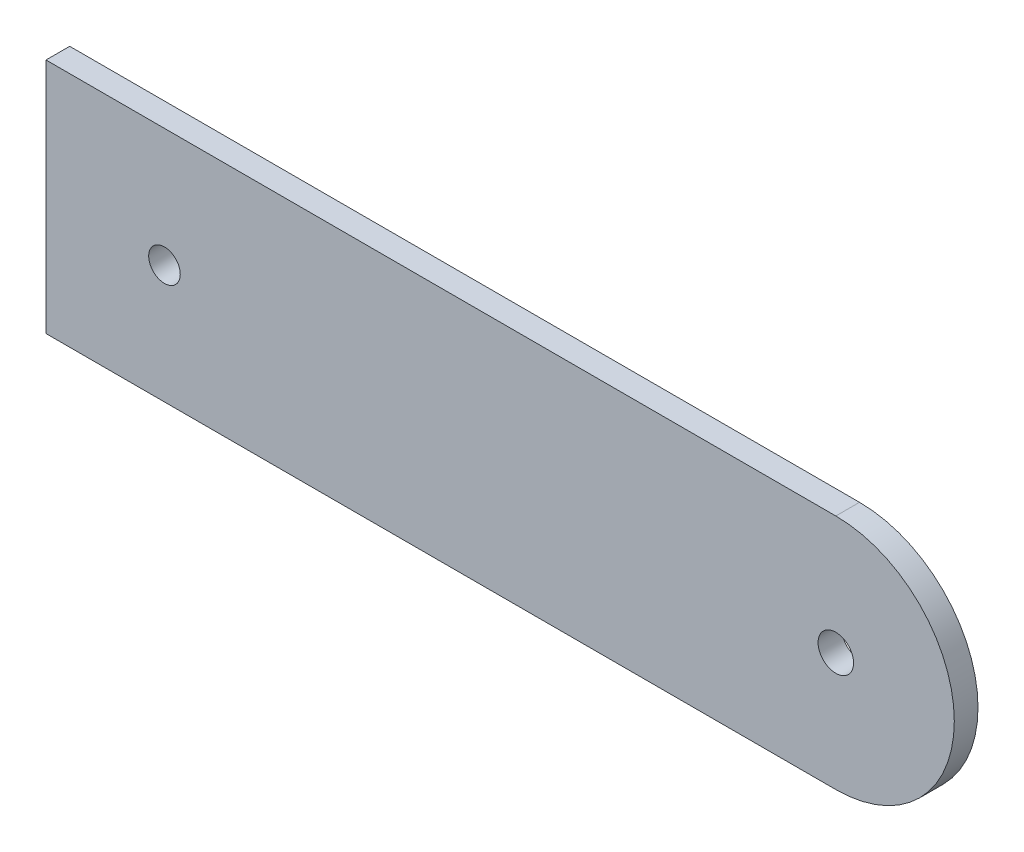
ISO-10303-21;
HEADER;
FILE_DESCRIPTION(('STEP AP214'),'2;1');
FILE_NAME('part.step','',(''),(''),'','','');
FILE_SCHEMA(('AUTOMOTIVE_DESIGN { 1 0 10303 214 1 1 1 1 }'));
ENDSEC;
DATA;
#1=APPLICATION_CONTEXT('core data for automotive mechanical design processes');
#2=APPLICATION_PROTOCOL_DEFINITION('international standard','automotive_design',2000,#1);
#3=PRODUCT_CONTEXT('',#1,'mechanical');
#4=PRODUCT('Part','Part','',(#3));
#5=PRODUCT_RELATED_PRODUCT_CATEGORY('part','',(#4));
#6=PRODUCT_DEFINITION_FORMATION('','',#4);
#7=PRODUCT_DEFINITION_CONTEXT('part definition',#1,'design');
#8=PRODUCT_DEFINITION('design','',#6,#7);
#9=PRODUCT_DEFINITION_SHAPE('','',#8);
#10=(LENGTH_UNIT() NAMED_UNIT(*) SI_UNIT(.MILLI.,.METRE.));
#11=(NAMED_UNIT(*) PLANE_ANGLE_UNIT() SI_UNIT($,.RADIAN.));
#12=(NAMED_UNIT(*) SI_UNIT($,.STERADIAN.) SOLID_ANGLE_UNIT());
#13=UNCERTAINTY_MEASURE_WITH_UNIT(LENGTH_MEASURE(1.E-05),#10,'distance_accuracy_value','');
#14=(GEOMETRIC_REPRESENTATION_CONTEXT(3) GLOBAL_UNCERTAINTY_ASSIGNED_CONTEXT((#13)) GLOBAL_UNIT_ASSIGNED_CONTEXT((#10,
#11,#12)) REPRESENTATION_CONTEXT('',''));
#15=CARTESIAN_POINT('',(0.,0.,0.));
#16=DIRECTION('',(0.,0.,1.));
#17=DIRECTION('',(1.,0.,0.));
#18=AXIS2_PLACEMENT_3D('',#15,#16,#17);
#19=CARTESIAN_POINT('',(100.,15.,3.));
#20=DIRECTION('',(0.,0.,-1.));
#21=DIRECTION('',(-1.,0.,0.));
#22=AXIS2_PLACEMENT_3D('',#19,#20,#21);
#23=PLANE('',#22);
#24=DIRECTION('',(0.,-1.,0.));
#25=VECTOR('',#24,1.);
#26=CARTESIAN_POINT('',(0.,0.,3.));
#27=LINE('',#26,#25);
#28=CARTESIAN_POINT('',(0.,30.,3.));
#29=VERTEX_POINT('',#28);
#30=CARTESIAN_POINT('',(0.,0.,3.));
#31=VERTEX_POINT('',#30);
#32=EDGE_CURVE('E96',#29,#31,#27,.T.);
#33=ORIENTED_EDGE('',*,*,#32,.T.);
#34=DIRECTION('',(1.,0.,0.));
#35=VECTOR('',#34,1.);
#36=CARTESIAN_POINT('',(0.,0.,3.));
#37=LINE('',#36,#35);
#38=CARTESIAN_POINT('',(100.,0.,3.));
#39=VERTEX_POINT('',#38);
#40=EDGE_CURVE('E91',#31,#39,#37,.T.);
#41=ORIENTED_EDGE('',*,*,#40,.T.);
#42=CARTESIAN_POINT('',(100.,15.,3.));
#43=DIRECTION('',(0.,0.,1.));
#44=DIRECTION('',(-1.,0.,0.));
#45=AXIS2_PLACEMENT_3D('',#42,#43,#44);
#46=CIRCLE('',#45,15.);
#47=CARTESIAN_POINT('',(100.,30.,3.));
#48=VERTEX_POINT('',#47);
#49=EDGE_CURVE('E94',#39,#48,#46,.T.);
#50=ORIENTED_EDGE('',*,*,#49,.T.);
#51=DIRECTION('',(-1.,0.,0.));
#52=VECTOR('',#51,1.);
#53=CARTESIAN_POINT('',(0.,30.,3.));
#54=LINE('',#53,#52);
#55=EDGE_CURVE('E61',#48,#29,#54,.T.);
#56=ORIENTED_EDGE('',*,*,#55,.T.);
#57=EDGE_LOOP('',(#33,#41,#50,#56));
#58=FACE_BOUND('',#57,.T.);
#59=CARTESIAN_POINT('',(100.,15.,3.));
#60=DIRECTION('',(0.,0.,1.));
#61=DIRECTION('',(1.,0.,0.));
#62=AXIS2_PLACEMENT_3D('',#59,#60,#61);
#63=CIRCLE('',#62,2.25);
#64=CARTESIAN_POINT('',(102.25,15.,3.));
#65=VERTEX_POINT('',#64);
#66=EDGE_CURVE('E116',#65,#65,#63,.T.);
#67=ORIENTED_EDGE('',*,*,#66,.F.);
#68=EDGE_LOOP('',(#67));
#69=FACE_BOUND('',#68,.T.);
#70=CARTESIAN_POINT('',(15.,15.,3.));
#71=DIRECTION('',(0.,0.,1.));
#72=DIRECTION('',(1.,0.,0.));
#73=AXIS2_PLACEMENT_3D('',#70,#71,#72);
#74=CIRCLE('',#73,2.);
#75=CARTESIAN_POINT('',(17.,15.,3.));
#76=VERTEX_POINT('',#75);
#77=EDGE_CURVE('E138',#76,#76,#74,.T.);
#78=ORIENTED_EDGE('',*,*,#77,.F.);
#79=EDGE_LOOP('',(#78));
#80=FACE_BOUND('',#79,.T.);
#81=ADVANCED_FACE('F43',(#58,#69,#80),#23,.F.);
#82=CARTESIAN_POINT('',(100.,15.,0.));
#83=DIRECTION('',(0.,0.,-1.));
#84=DIRECTION('',(-1.,0.,0.));
#85=AXIS2_PLACEMENT_3D('',#82,#83,#84);
#86=PLANE('',#85);
#87=CARTESIAN_POINT('',(100.,15.,0.));
#88=DIRECTION('',(0.,0.,1.));
#89=DIRECTION('',(1.,0.,0.));
#90=AXIS2_PLACEMENT_3D('',#87,#88,#89);
#91=CIRCLE('',#90,2.25);
#92=CARTESIAN_POINT('',(102.25,15.,0.));
#93=VERTEX_POINT('',#92);
#94=EDGE_CURVE('E134',#93,#93,#91,.T.);
#95=ORIENTED_EDGE('',*,*,#94,.T.);
#96=EDGE_LOOP('',(#95));
#97=FACE_BOUND('',#96,.T.);
#98=DIRECTION('',(0.,-1.,0.));
#99=VECTOR('',#98,1.);
#100=CARTESIAN_POINT('',(0.,0.,0.));
#101=LINE('',#100,#99);
#102=CARTESIAN_POINT('',(0.,30.,0.));
#103=VERTEX_POINT('',#102);
#104=CARTESIAN_POINT('',(0.,0.,0.));
#105=VERTEX_POINT('',#104);
#106=EDGE_CURVE('E112',#103,#105,#101,.T.);
#107=ORIENTED_EDGE('',*,*,#106,.F.);
#108=DIRECTION('',(-1.,0.,0.));
#109=VECTOR('',#108,1.);
#110=CARTESIAN_POINT('',(0.,30.,0.));
#111=LINE('',#110,#109);
#112=CARTESIAN_POINT('',(100.,30.,0.));
#113=VERTEX_POINT('',#112);
#114=EDGE_CURVE('E84',#113,#103,#111,.T.);
#115=ORIENTED_EDGE('',*,*,#114,.F.);
#116=CARTESIAN_POINT('',(100.,15.,0.));
#117=DIRECTION('',(0.,0.,1.));
#118=DIRECTION('',(-1.,0.,0.));
#119=AXIS2_PLACEMENT_3D('',#116,#117,#118);
#120=CIRCLE('',#119,15.);
#121=CARTESIAN_POINT('',(100.,0.,0.));
#122=VERTEX_POINT('',#121);
#123=EDGE_CURVE('E78',#122,#113,#120,.T.);
#124=ORIENTED_EDGE('',*,*,#123,.F.);
#125=DIRECTION('',(1.,0.,0.));
#126=VECTOR('',#125,1.);
#127=CARTESIAN_POINT('',(0.,0.,0.));
#128=LINE('',#127,#126);
#129=EDGE_CURVE('E101',#105,#122,#128,.T.);
#130=ORIENTED_EDGE('',*,*,#129,.F.);
#131=EDGE_LOOP('',(#107,#115,#124,#130));
#132=FACE_BOUND('',#131,.T.);
#133=CARTESIAN_POINT('',(15.,15.,0.));
#134=DIRECTION('',(0.,0.,1.));
#135=DIRECTION('',(1.,0.,0.));
#136=AXIS2_PLACEMENT_3D('',#133,#134,#135);
#137=CIRCLE('',#136,2.);
#138=CARTESIAN_POINT('',(17.,15.,0.));
#139=VERTEX_POINT('',#138);
#140=EDGE_CURVE('E142',#139,#139,#137,.T.);
#141=ORIENTED_EDGE('',*,*,#140,.T.);
#142=EDGE_LOOP('',(#141));
#143=FACE_BOUND('',#142,.T.);
#144=ADVANCED_FACE('F129',(#97,#132,#143),#86,.T.);
#145=CARTESIAN_POINT('',(0.,0.,3.));
#146=DIRECTION('',(1.,0.,0.));
#147=DIRECTION('',(0.,0.,-1.));
#148=AXIS2_PLACEMENT_3D('',#145,#146,#147);
#149=PLANE('',#148);
#150=ORIENTED_EDGE('',*,*,#106,.T.);
#151=DIRECTION('',(0.,0.,-1.));
#152=VECTOR('',#151,1.);
#153=CARTESIAN_POINT('',(0.,0.,3.));
#154=LINE('',#153,#152);
#155=EDGE_CURVE('E11',#31,#105,#154,.T.);
#156=ORIENTED_EDGE('',*,*,#155,.F.);
#157=ORIENTED_EDGE('',*,*,#32,.F.);
#158=DIRECTION('',(0.,0.,-1.));
#159=VECTOR('',#158,1.);
#160=CARTESIAN_POINT('',(0.,30.,3.));
#161=LINE('',#160,#159);
#162=EDGE_CURVE('E108',#29,#103,#161,.T.);
#163=ORIENTED_EDGE('',*,*,#162,.T.);
#164=EDGE_LOOP('',(#150,#156,#157,#163));
#165=FACE_BOUND('',#164,.T.);
#166=ADVANCED_FACE('F45',(#165),#149,.F.);
#167=CARTESIAN_POINT('',(0.,0.,3.));
#168=DIRECTION('',(0.,1.,0.));
#169=DIRECTION('',(0.,0.,1.));
#170=AXIS2_PLACEMENT_3D('',#167,#168,#169);
#171=PLANE('',#170);
#172=ORIENTED_EDGE('',*,*,#129,.T.);
#173=DIRECTION('',(0.,0.,-1.));
#174=VECTOR('',#173,1.);
#175=CARTESIAN_POINT('',(100.,0.,3.));
#176=LINE('',#175,#174);
#177=EDGE_CURVE('E53',#39,#122,#176,.T.);
#178=ORIENTED_EDGE('',*,*,#177,.F.);
#179=ORIENTED_EDGE('',*,*,#40,.F.);
#180=ORIENTED_EDGE('',*,*,#155,.T.);
#181=EDGE_LOOP('',(#172,#178,#179,#180));
#182=FACE_BOUND('',#181,.T.);
#183=ADVANCED_FACE('F100',(#182),#171,.F.);
#184=CARTESIAN_POINT('',(100.,15.,3.));
#185=DIRECTION('',(0.,0.,-1.));
#186=DIRECTION('',(-1.,0.,0.));
#187=AXIS2_PLACEMENT_3D('',#184,#185,#186);
#188=CYLINDRICAL_SURFACE('',#187,15.);
#189=ORIENTED_EDGE('',*,*,#123,.T.);
#190=DIRECTION('',(0.,0.,-1.));
#191=VECTOR('',#190,1.);
#192=CARTESIAN_POINT('',(100.,30.,3.));
#193=LINE('',#192,#191);
#194=EDGE_CURVE('E103',#48,#113,#193,.T.);
#195=ORIENTED_EDGE('',*,*,#194,.F.);
#196=ORIENTED_EDGE('',*,*,#49,.F.);
#197=ORIENTED_EDGE('',*,*,#177,.T.);
#198=EDGE_LOOP('',(#189,#195,#196,#197));
#199=FACE_BOUND('',#198,.T.);
#200=ADVANCED_FACE('F104',(#199),#188,.T.);
#201=CARTESIAN_POINT('',(0.,30.,3.));
#202=DIRECTION('',(0.,-1.,0.));
#203=DIRECTION('',(0.,0.,-1.));
#204=AXIS2_PLACEMENT_3D('',#201,#202,#203);
#205=PLANE('',#204);
#206=ORIENTED_EDGE('',*,*,#114,.T.);
#207=ORIENTED_EDGE('',*,*,#162,.F.);
#208=ORIENTED_EDGE('',*,*,#55,.F.);
#209=ORIENTED_EDGE('',*,*,#194,.T.);
#210=EDGE_LOOP('',(#206,#207,#208,#209));
#211=FACE_BOUND('',#210,.T.);
#212=ADVANCED_FACE('F126',(#211),#205,.F.);
#213=CARTESIAN_POINT('',(100.,15.,3.));
#214=DIRECTION('',(0.,0.,-1.));
#215=DIRECTION('',(-1.,0.,0.));
#216=AXIS2_PLACEMENT_3D('',#213,#214,#215);
#217=CYLINDRICAL_SURFACE('',#216,2.25);
#218=ORIENTED_EDGE('',*,*,#66,.T.);
#219=EDGE_LOOP('',(#218));
#220=FACE_BOUND('',#219,.T.);
#221=ORIENTED_EDGE('',*,*,#94,.F.);
#222=EDGE_LOOP('',(#221));
#223=FACE_BOUND('',#222,.T.);
#224=ADVANCED_FACE('F161',(#220,#223),#217,.F.);
#225=CARTESIAN_POINT('',(15.,15.,3.));
#226=DIRECTION('',(0.,0.,-1.));
#227=DIRECTION('',(-1.,0.,0.));
#228=AXIS2_PLACEMENT_3D('',#225,#226,#227);
#229=CYLINDRICAL_SURFACE('',#228,2.);
#230=ORIENTED_EDGE('',*,*,#77,.T.);
#231=EDGE_LOOP('',(#230));
#232=FACE_BOUND('',#231,.T.);
#233=ORIENTED_EDGE('',*,*,#140,.F.);
#234=EDGE_LOOP('',(#233));
#235=FACE_BOUND('',#234,.T.);
#236=ADVANCED_FACE('F150',(#232,#235),#229,.F.);
#237=CLOSED_SHELL('',(#81,#144,#166,#183,#200,#212,#224,#236));
#238=MANIFOLD_SOLID_BREP('B2',#237);
#239=ADVANCED_BREP_SHAPE_REPRESENTATION('',(#18,#238),#14);
#240=SHAPE_DEFINITION_REPRESENTATION(#9,#239);
ENDSEC;
END-ISO-10303-21;
